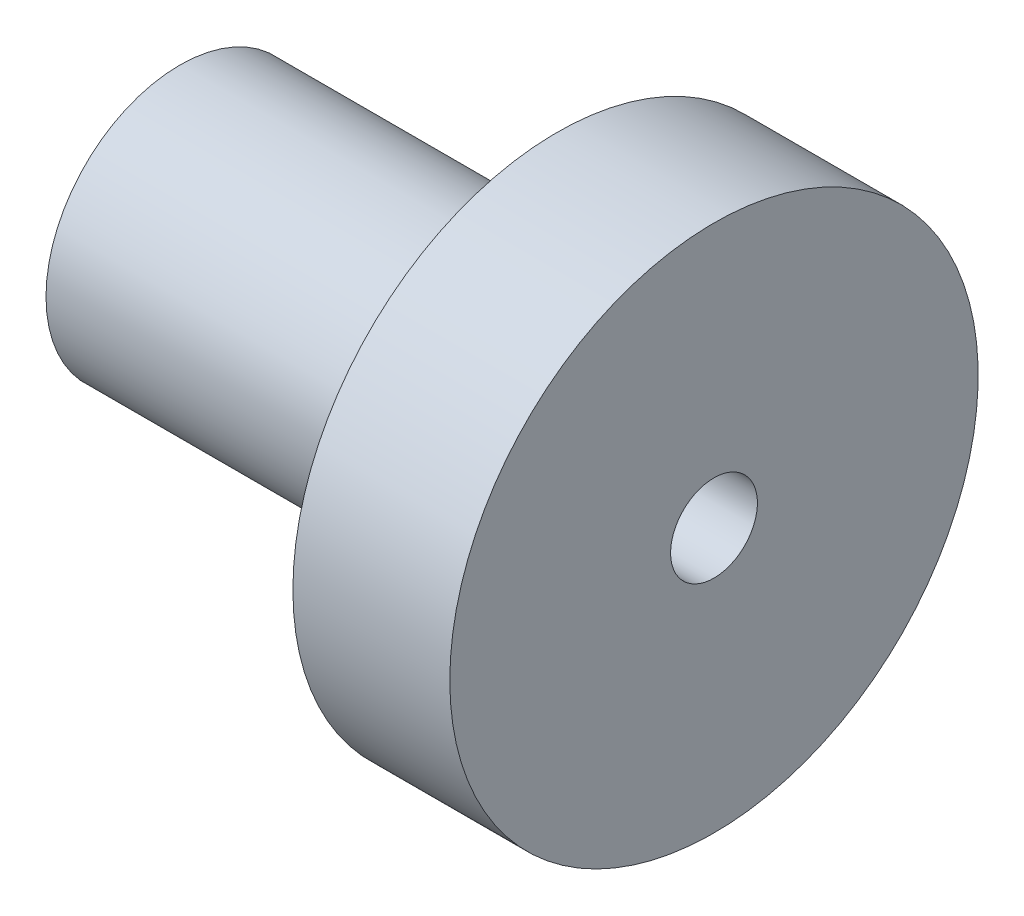
ISO-10303-21;
HEADER;
FILE_DESCRIPTION(('STEP AP214'),'2;1');
FILE_NAME('part.step','',(''),(''),'','','');
FILE_SCHEMA(('AUTOMOTIVE_DESIGN { 1 0 10303 214 1 1 1 1 }'));
ENDSEC;
DATA;
#1=APPLICATION_CONTEXT('core data for automotive mechanical design processes');
#2=APPLICATION_PROTOCOL_DEFINITION('international standard','automotive_design',2000,#1);
#3=PRODUCT_CONTEXT('',#1,'mechanical');
#4=PRODUCT('Part','Part','',(#3));
#5=PRODUCT_RELATED_PRODUCT_CATEGORY('part','',(#4));
#6=PRODUCT_DEFINITION_FORMATION('','',#4);
#7=PRODUCT_DEFINITION_CONTEXT('part definition',#1,'design');
#8=PRODUCT_DEFINITION('design','',#6,#7);
#9=PRODUCT_DEFINITION_SHAPE('','',#8);
#10=(LENGTH_UNIT() NAMED_UNIT(*) SI_UNIT(.MILLI.,.METRE.));
#11=(NAMED_UNIT(*) PLANE_ANGLE_UNIT() SI_UNIT($,.RADIAN.));
#12=(NAMED_UNIT(*) SI_UNIT($,.STERADIAN.) SOLID_ANGLE_UNIT());
#13=UNCERTAINTY_MEASURE_WITH_UNIT(LENGTH_MEASURE(1.E-05),#10,'distance_accuracy_value','');
#14=(GEOMETRIC_REPRESENTATION_CONTEXT(3) GLOBAL_UNCERTAINTY_ASSIGNED_CONTEXT((#13)) GLOBAL_UNIT_ASSIGNED_CONTEXT((#10,
#11,#12)) REPRESENTATION_CONTEXT('',''));
#15=CARTESIAN_POINT('',(0.,0.,0.));
#16=DIRECTION('',(0.,0.,1.));
#17=DIRECTION('',(1.,0.,0.));
#18=AXIS2_PLACEMENT_3D('',#15,#16,#17);
#19=CARTESIAN_POINT('',(0.,0.,0.));
#20=DIRECTION('',(1.,0.,0.));
#21=DIRECTION('',(0.,0.,-1.));
#22=AXIS2_PLACEMENT_3D('',#19,#20,#21);
#23=PLANE('',#22);
#24=CARTESIAN_POINT('',(0.,0.,0.));
#25=DIRECTION('',(-1.,0.,0.));
#26=DIRECTION('',(0.,0.,1.));
#27=AXIS2_PLACEMENT_3D('',#24,#25,#26);
#28=CIRCLE('',#27,7.79586854944823);
#29=CARTESIAN_POINT('',(0.,0.,7.79586854944823));
#30=VERTEX_POINT('',#29);
#31=EDGE_CURVE('E53',#30,#30,#28,.T.);
#32=ORIENTED_EDGE('',*,*,#31,.F.);
#33=EDGE_LOOP('',(#32));
#34=FACE_BOUND('',#33,.T.);
#35=CARTESIAN_POINT('',(0.,0.,0.));
#36=DIRECTION('',(-1.,0.,0.));
#37=DIRECTION('',(0.,0.,1.));
#38=AXIS2_PLACEMENT_3D('',#35,#36,#37);
#39=CIRCLE('',#38,24.0252057258488);
#40=CARTESIAN_POINT('',(0.,0.,24.0252057258488));
#41=VERTEX_POINT('',#40);
#42=EDGE_CURVE('E10',#41,#41,#39,.T.);
#43=ORIENTED_EDGE('',*,*,#42,.T.);
#44=EDGE_LOOP('',(#43));
#45=FACE_BOUND('',#44,.T.);
#46=ADVANCED_FACE('F33',(#34,#45),#23,.F.);
#47=CARTESIAN_POINT('',(0.,0.,0.));
#48=DIRECTION('',(-1.,0.,0.));
#49=DIRECTION('',(0.,0.,1.));
#50=AXIS2_PLACEMENT_3D('',#47,#48,#49);
#51=CYLINDRICAL_SURFACE('',#50,24.0252057258488);
#52=ORIENTED_EDGE('',*,*,#42,.F.);
#53=EDGE_LOOP('',(#52));
#54=FACE_BOUND('',#53,.T.);
#55=CARTESIAN_POINT('',(67.7262264857978,0.,0.));
#56=DIRECTION('',(-1.,0.,0.));
#57=DIRECTION('',(0.,0.,1.));
#58=AXIS2_PLACEMENT_3D('',#55,#56,#57);
#59=CIRCLE('',#58,24.0252057258488);
#60=CARTESIAN_POINT('',(67.7262264857978,0.,24.0252057258488));
#61=VERTEX_POINT('',#60);
#62=EDGE_CURVE('E39',#61,#61,#59,.T.);
#63=ORIENTED_EDGE('',*,*,#62,.T.);
#64=EDGE_LOOP('',(#63));
#65=FACE_BOUND('',#64,.T.);
#66=ADVANCED_FACE('F69',(#54,#65),#51,.T.);
#67=CARTESIAN_POINT('',(67.7262264857978,47.4290699243049,0.));
#68=DIRECTION('',(1.,0.,0.));
#69=DIRECTION('',(0.,0.,-1.));
#70=AXIS2_PLACEMENT_3D('',#67,#68,#69);
#71=PLANE('',#70);
#72=ORIENTED_EDGE('',*,*,#62,.F.);
#73=EDGE_LOOP('',(#72));
#74=FACE_BOUND('',#73,.T.);
#75=CARTESIAN_POINT('',(67.7262264857978,0.,0.));
#76=DIRECTION('',(-1.,0.,0.));
#77=DIRECTION('',(0.,0.,1.));
#78=AXIS2_PLACEMENT_3D('',#75,#76,#77);
#79=CIRCLE('',#78,47.4290699243049);
#80=CARTESIAN_POINT('',(67.7262264857978,0.,47.4290699243049));
#81=VERTEX_POINT('',#80);
#82=EDGE_CURVE('E43',#81,#81,#79,.T.);
#83=ORIENTED_EDGE('',*,*,#82,.T.);
#84=EDGE_LOOP('',(#83));
#85=FACE_BOUND('',#84,.T.);
#86=ADVANCED_FACE('F73',(#74,#85),#71,.F.);
#87=CARTESIAN_POINT('',(0.,0.,0.));
#88=DIRECTION('',(-1.,0.,0.));
#89=DIRECTION('',(0.,0.,1.));
#90=AXIS2_PLACEMENT_3D('',#87,#88,#89);
#91=CYLINDRICAL_SURFACE('',#90,47.4290699243049);
#92=ORIENTED_EDGE('',*,*,#82,.F.);
#93=EDGE_LOOP('',(#92));
#94=FACE_BOUND('',#93,.T.);
#95=CARTESIAN_POINT('',(95.8937090609308,0.,0.));
#96=DIRECTION('',(-1.,0.,0.));
#97=DIRECTION('',(0.,0.,1.));
#98=AXIS2_PLACEMENT_3D('',#95,#96,#97);
#99=CIRCLE('',#98,47.4290699243049);
#100=CARTESIAN_POINT('',(95.8937090609308,0.,47.4290699243049));
#101=VERTEX_POINT('',#100);
#102=EDGE_CURVE('E47',#101,#101,#99,.T.);
#103=ORIENTED_EDGE('',*,*,#102,.T.);
#104=EDGE_LOOP('',(#103));
#105=FACE_BOUND('',#104,.T.);
#106=ADVANCED_FACE('F78',(#94,#105),#91,.T.);
#107=CARTESIAN_POINT('',(95.8937090609308,0.,0.));
#108=DIRECTION('',(-1.,0.,0.));
#109=DIRECTION('',(0.,0.,1.));
#110=AXIS2_PLACEMENT_3D('',#107,#108,#109);
#111=PLANE('',#110);
#112=CARTESIAN_POINT('',(95.8937090609308,0.,0.));
#113=DIRECTION('',(-1.,0.,0.));
#114=DIRECTION('',(0.,0.,1.));
#115=AXIS2_PLACEMENT_3D('',#112,#113,#114);
#116=CIRCLE('',#115,7.79586854944823);
#117=CARTESIAN_POINT('',(95.8937090609308,0.,7.79586854944823));
#118=VERTEX_POINT('',#117);
#119=EDGE_CURVE('E52',#118,#118,#116,.T.);
#120=ORIENTED_EDGE('',*,*,#119,.T.);
#121=EDGE_LOOP('',(#120));
#122=FACE_BOUND('',#121,.T.);
#123=ORIENTED_EDGE('',*,*,#102,.F.);
#124=EDGE_LOOP('',(#123));
#125=FACE_BOUND('',#124,.T.);
#126=ADVANCED_FACE('F59',(#122,#125),#111,.F.);
#127=CARTESIAN_POINT('',(95.8937090609308,0.,0.));
#128=DIRECTION('',(-1.,0.,0.));
#129=DIRECTION('',(0.,0.,1.));
#130=AXIS2_PLACEMENT_3D('',#127,#128,#129);
#131=CYLINDRICAL_SURFACE('',#130,7.79586854944823);
#132=ORIENTED_EDGE('',*,*,#119,.F.);
#133=EDGE_LOOP('',(#132));
#134=FACE_BOUND('',#133,.T.);
#135=ORIENTED_EDGE('',*,*,#31,.T.);
#136=EDGE_LOOP('',(#135));
#137=FACE_BOUND('',#136,.T.);
#138=ADVANCED_FACE('F62',(#134,#137),#131,.F.);
#139=CLOSED_SHELL('',(#46,#66,#86,#106,#126,#138));
#140=MANIFOLD_SOLID_BREP('B2',#139);
#141=ADVANCED_BREP_SHAPE_REPRESENTATION('',(#18,#140),#14);
#142=SHAPE_DEFINITION_REPRESENTATION(#9,#141);
ENDSEC;
END-ISO-10303-21;
